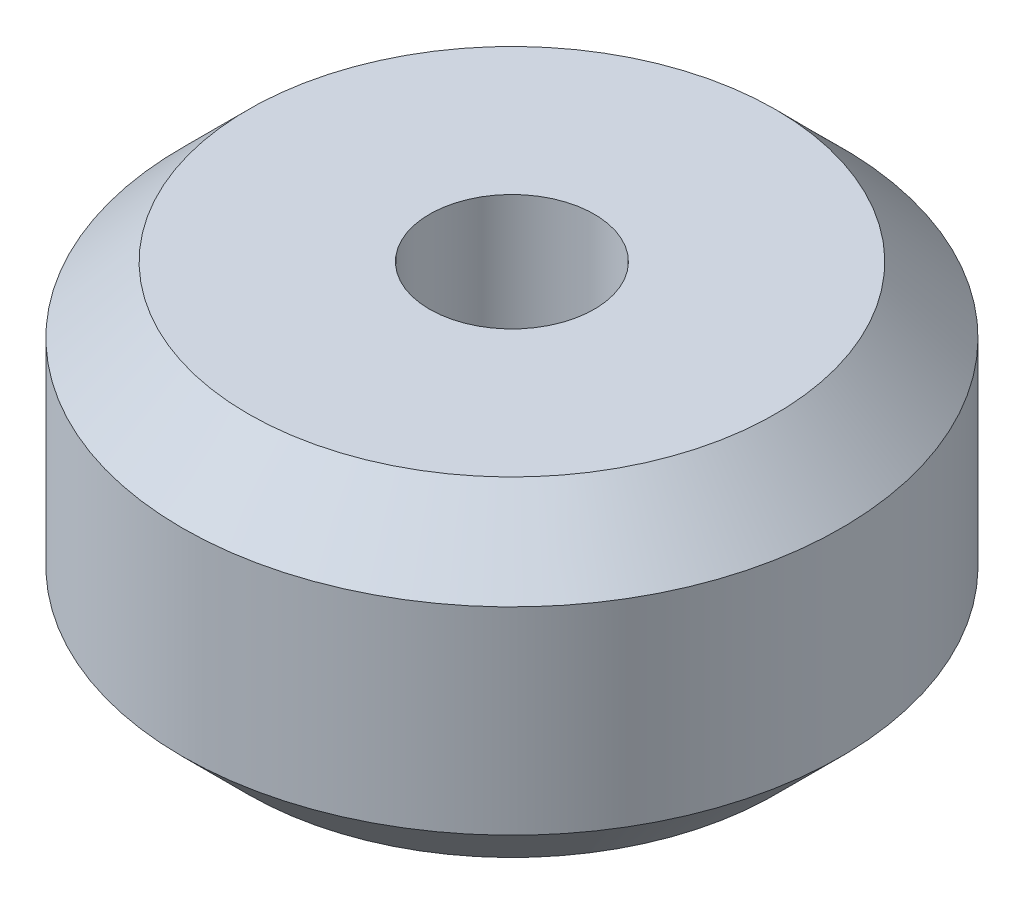
ISO-10303-21;
HEADER;
FILE_DESCRIPTION(('STEP AP214'),'2;1');
FILE_NAME('part.step','',(''),(''),'','','');
FILE_SCHEMA(('AUTOMOTIVE_DESIGN { 1 0 10303 214 1 1 1 1 }'));
ENDSEC;
DATA;
#1=APPLICATION_CONTEXT('core data for automotive mechanical design processes');
#2=APPLICATION_PROTOCOL_DEFINITION('international standard','automotive_design',2000,#1);
#3=PRODUCT_CONTEXT('',#1,'mechanical');
#4=PRODUCT('Part','Part','',(#3));
#5=PRODUCT_RELATED_PRODUCT_CATEGORY('part','',(#4));
#6=PRODUCT_DEFINITION_FORMATION('','',#4);
#7=PRODUCT_DEFINITION_CONTEXT('part definition',#1,'design');
#8=PRODUCT_DEFINITION('design','',#6,#7);
#9=PRODUCT_DEFINITION_SHAPE('','',#8);
#10=(LENGTH_UNIT() NAMED_UNIT(*) SI_UNIT(.MILLI.,.METRE.));
#11=(NAMED_UNIT(*) PLANE_ANGLE_UNIT() SI_UNIT($,.RADIAN.));
#12=(NAMED_UNIT(*) SI_UNIT($,.STERADIAN.) SOLID_ANGLE_UNIT());
#13=UNCERTAINTY_MEASURE_WITH_UNIT(LENGTH_MEASURE(1.E-05),#10,'distance_accuracy_value','');
#14=(GEOMETRIC_REPRESENTATION_CONTEXT(3) GLOBAL_UNCERTAINTY_ASSIGNED_CONTEXT((#13)) GLOBAL_UNIT_ASSIGNED_CONTEXT((#10,
#11,#12)) REPRESENTATION_CONTEXT('',''));
#15=CARTESIAN_POINT('',(0.,0.,0.));
#16=DIRECTION('',(0.,0.,1.));
#17=DIRECTION('',(1.,0.,0.));
#18=AXIS2_PLACEMENT_3D('',#15,#16,#17);
#19=CARTESIAN_POINT('',(0.,23.8922788621481,0.));
#20=DIRECTION('',(0.,1.,0.));
#21=DIRECTION('',(0.,0.,1.));
#22=AXIS2_PLACEMENT_3D('',#19,#20,#21);
#23=CYLINDRICAL_SURFACE('',#22,10.);
#24=CARTESIAN_POINT('',(0.,-3.00000000000001,0.));
#25=DIRECTION('',(0.,1.,0.));
#26=DIRECTION('',(0.,0.,1.));
#27=AXIS2_PLACEMENT_3D('',#24,#25,#26);
#28=CIRCLE('',#27,10.);
#29=CARTESIAN_POINT('',(0.,-3.00000000000001,10.));
#30=VERTEX_POINT('',#29);
#31=EDGE_CURVE('E10',#30,#30,#28,.T.);
#32=ORIENTED_EDGE('',*,*,#31,.T.);
#33=EDGE_LOOP('',(#32));
#34=FACE_BOUND('',#33,.T.);
#35=CARTESIAN_POINT('',(0.,3.,0.));
#36=DIRECTION('',(0.,1.,0.));
#37=DIRECTION('',(0.,0.,1.));
#38=AXIS2_PLACEMENT_3D('',#35,#36,#37);
#39=CIRCLE('',#38,10.);
#40=CARTESIAN_POINT('',(0.,3.,10.));
#41=VERTEX_POINT('',#40);
#42=EDGE_CURVE('E65',#41,#41,#39,.T.);
#43=ORIENTED_EDGE('',*,*,#42,.F.);
#44=EDGE_LOOP('',(#43));
#45=FACE_BOUND('',#44,.T.);
#46=ADVANCED_FACE('F43',(#34,#45),#23,.T.);
#47=CARTESIAN_POINT('',(0.,-3.00000000000001,0.));
#48=DIRECTION('',(0.,1.,0.));
#49=DIRECTION('',(0.,0.,1.));
#50=AXIS2_PLACEMENT_3D('',#47,#48,#49);
#51=CONICAL_SURFACE('',#50,10.,0.785398163397447);
#52=CARTESIAN_POINT('',(0.,-5.00000000000002,0.));
#53=DIRECTION('',(0.,1.,0.));
#54=DIRECTION('',(0.,0.,1.));
#55=AXIS2_PLACEMENT_3D('',#52,#53,#54);
#56=CIRCLE('',#55,7.99999999999999);
#57=CARTESIAN_POINT('',(0.,-5.00000000000002,7.99999999999999));
#58=VERTEX_POINT('',#57);
#59=EDGE_CURVE('E49',#58,#58,#56,.T.);
#60=ORIENTED_EDGE('',*,*,#59,.T.);
#61=EDGE_LOOP('',(#60));
#62=FACE_BOUND('',#61,.T.);
#63=ORIENTED_EDGE('',*,*,#31,.F.);
#64=EDGE_LOOP('',(#63));
#65=FACE_BOUND('',#64,.T.);
#66=ADVANCED_FACE('F72',(#62,#65),#51,.T.);
#67=CARTESIAN_POINT('',(-7.99999999999999,-5.00000000000002,0.));
#68=DIRECTION('',(0.,-1.,0.));
#69=DIRECTION('',(0.,0.,-1.));
#70=AXIS2_PLACEMENT_3D('',#67,#68,#69);
#71=PLANE('',#70);
#72=CARTESIAN_POINT('',(0.,-5.00000000000002,0.));
#73=DIRECTION('',(0.,1.,0.));
#74=DIRECTION('',(0.,0.,1.));
#75=AXIS2_PLACEMENT_3D('',#72,#73,#74);
#76=CIRCLE('',#75,2.5);
#77=CARTESIAN_POINT('',(0.,-5.00000000000002,2.5));
#78=VERTEX_POINT('',#77);
#79=EDGE_CURVE('E53',#78,#78,#76,.T.);
#80=ORIENTED_EDGE('',*,*,#79,.T.);
#81=EDGE_LOOP('',(#80));
#82=FACE_BOUND('',#81,.T.);
#83=ORIENTED_EDGE('',*,*,#59,.F.);
#84=EDGE_LOOP('',(#83));
#85=FACE_BOUND('',#84,.T.);
#86=ADVANCED_FACE('F76',(#82,#85),#71,.T.);
#87=CARTESIAN_POINT('',(0.,23.8922788621481,0.));
#88=DIRECTION('',(0.,1.,0.));
#89=DIRECTION('',(0.,0.,1.));
#90=AXIS2_PLACEMENT_3D('',#87,#88,#89);
#91=CYLINDRICAL_SURFACE('',#90,2.5);
#92=CARTESIAN_POINT('',(0.,4.99999999999997,0.));
#93=DIRECTION('',(0.,1.,0.));
#94=DIRECTION('',(0.,0.,1.));
#95=AXIS2_PLACEMENT_3D('',#92,#93,#94);
#96=CIRCLE('',#95,2.5);
#97=CARTESIAN_POINT('',(0.,4.99999999999997,2.5));
#98=VERTEX_POINT('',#97);
#99=EDGE_CURVE('E57',#98,#98,#96,.T.);
#100=ORIENTED_EDGE('',*,*,#99,.T.);
#101=EDGE_LOOP('',(#100));
#102=FACE_BOUND('',#101,.T.);
#103=ORIENTED_EDGE('',*,*,#79,.F.);
#104=EDGE_LOOP('',(#103));
#105=FACE_BOUND('',#104,.T.);
#106=ADVANCED_FACE('F80',(#102,#105),#91,.F.);
#107=CARTESIAN_POINT('',(-2.5,4.99999999999997,0.));
#108=DIRECTION('',(0.,1.,0.));
#109=DIRECTION('',(0.,0.,1.));
#110=AXIS2_PLACEMENT_3D('',#107,#108,#109);
#111=PLANE('',#110);
#112=CARTESIAN_POINT('',(0.,4.99999999999998,0.));
#113=DIRECTION('',(0.,1.,0.));
#114=DIRECTION('',(0.,0.,1.));
#115=AXIS2_PLACEMENT_3D('',#112,#113,#114);
#116=CIRCLE('',#115,8.);
#117=CARTESIAN_POINT('',(0.,4.99999999999998,8.));
#118=VERTEX_POINT('',#117);
#119=EDGE_CURVE('E62',#118,#118,#116,.T.);
#120=ORIENTED_EDGE('',*,*,#119,.T.);
#121=EDGE_LOOP('',(#120));
#122=FACE_BOUND('',#121,.T.);
#123=ORIENTED_EDGE('',*,*,#99,.F.);
#124=EDGE_LOOP('',(#123));
#125=FACE_BOUND('',#124,.T.);
#126=ADVANCED_FACE('F87',(#122,#125),#111,.T.);
#127=CARTESIAN_POINT('',(0.,3.,0.));
#128=DIRECTION('',(0.,-1.,0.));
#129=DIRECTION('',(0.,0.,-1.));
#130=AXIS2_PLACEMENT_3D('',#127,#128,#129);
#131=CONICAL_SURFACE('',#130,10.,0.785398163397453);
#132=ORIENTED_EDGE('',*,*,#119,.F.);
#133=EDGE_LOOP('',(#132));
#134=FACE_BOUND('',#133,.T.);
#135=ORIENTED_EDGE('',*,*,#42,.T.);
#136=EDGE_LOOP('',(#135));
#137=FACE_BOUND('',#136,.T.);
#138=ADVANCED_FACE('F69',(#134,#137),#131,.T.);
#139=CLOSED_SHELL('',(#46,#66,#86,#106,#126,#138));
#140=MANIFOLD_SOLID_BREP('B2',#139);
#141=ADVANCED_BREP_SHAPE_REPRESENTATION('',(#18,#140),#14);
#142=SHAPE_DEFINITION_REPRESENTATION(#9,#141);
ENDSEC;
END-ISO-10303-21;
